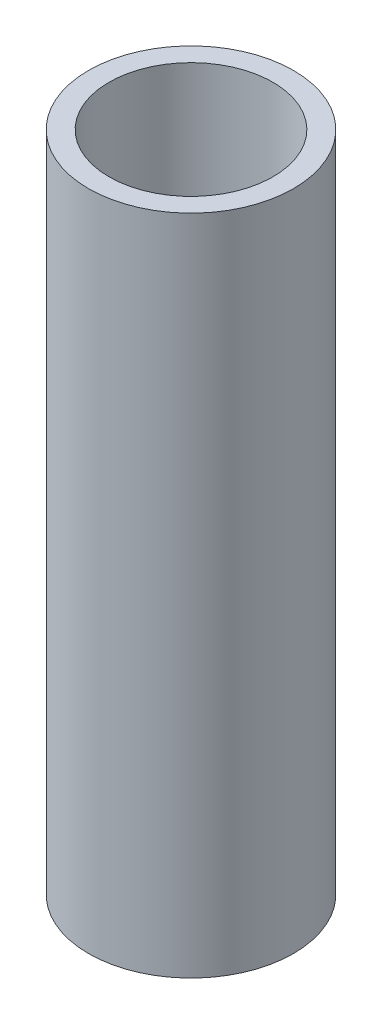
ISO-10303-21;
HEADER;
FILE_DESCRIPTION(('STEP AP214'),'2;1');
FILE_NAME('part.step','',(''),(''),'','','');
FILE_SCHEMA(('AUTOMOTIVE_DESIGN { 1 0 10303 214 1 1 1 1 }'));
ENDSEC;
DATA;
#1=APPLICATION_CONTEXT('core data for automotive mechanical design processes');
#2=APPLICATION_PROTOCOL_DEFINITION('international standard','automotive_design',2000,#1);
#3=PRODUCT_CONTEXT('',#1,'mechanical');
#4=PRODUCT('Part','Part','',(#3));
#5=PRODUCT_RELATED_PRODUCT_CATEGORY('part','',(#4));
#6=PRODUCT_DEFINITION_FORMATION('','',#4);
#7=PRODUCT_DEFINITION_CONTEXT('part definition',#1,'design');
#8=PRODUCT_DEFINITION('design','',#6,#7);
#9=PRODUCT_DEFINITION_SHAPE('','',#8);
#10=(LENGTH_UNIT() NAMED_UNIT(*) SI_UNIT(.MILLI.,.METRE.));
#11=(NAMED_UNIT(*) PLANE_ANGLE_UNIT() SI_UNIT($,.RADIAN.));
#12=(NAMED_UNIT(*) SI_UNIT($,.STERADIAN.) SOLID_ANGLE_UNIT());
#13=UNCERTAINTY_MEASURE_WITH_UNIT(LENGTH_MEASURE(1.E-05),#10,'distance_accuracy_value','');
#14=(GEOMETRIC_REPRESENTATION_CONTEXT(3) GLOBAL_UNCERTAINTY_ASSIGNED_CONTEXT((#13)) GLOBAL_UNIT_ASSIGNED_CONTEXT((#10,
#11,#12)) REPRESENTATION_CONTEXT('',''));
#15=CARTESIAN_POINT('',(0.,0.,0.));
#16=DIRECTION('',(0.,0.,1.));
#17=DIRECTION('',(1.,0.,0.));
#18=AXIS2_PLACEMENT_3D('',#15,#16,#17);
#19=CARTESIAN_POINT('',(0.,2.425,0.));
#20=DIRECTION('',(0.,-1.,0.));
#21=DIRECTION('',(0.,0.,-1.));
#22=AXIS2_PLACEMENT_3D('',#19,#20,#21);
#23=CYLINDRICAL_SURFACE('',#22,0.375);
#24=CARTESIAN_POINT('',(0.,2.425,0.));
#25=DIRECTION('',(0.,1.,0.));
#26=DIRECTION('',(0.,0.,1.));
#27=AXIS2_PLACEMENT_3D('',#24,#25,#26);
#28=CIRCLE('',#27,0.375);
#29=CARTESIAN_POINT('',(0.,2.425,0.375));
#30=VERTEX_POINT('',#29);
#31=EDGE_CURVE('E10',#30,#30,#28,.T.);
#32=ORIENTED_EDGE('',*,*,#31,.F.);
#33=EDGE_LOOP('',(#32));
#34=FACE_BOUND('',#33,.T.);
#35=CARTESIAN_POINT('',(0.,0.,0.));
#36=DIRECTION('',(0.,1.,0.));
#37=DIRECTION('',(0.,0.,1.));
#38=AXIS2_PLACEMENT_3D('',#35,#36,#37);
#39=CIRCLE('',#38,0.375);
#40=CARTESIAN_POINT('',(0.,0.,0.375));
#41=VERTEX_POINT('',#40);
#42=EDGE_CURVE('E34',#41,#41,#39,.T.);
#43=ORIENTED_EDGE('',*,*,#42,.T.);
#44=EDGE_LOOP('',(#43));
#45=FACE_BOUND('',#44,.T.);
#46=ADVANCED_FACE('F31',(#34,#45),#23,.T.);
#47=CARTESIAN_POINT('',(0.,2.425,0.));
#48=DIRECTION('',(0.,1.,0.));
#49=DIRECTION('',(0.,0.,1.));
#50=AXIS2_PLACEMENT_3D('',#47,#48,#49);
#51=PLANE('',#50);
#52=CARTESIAN_POINT('',(0.,2.425,0.));
#53=DIRECTION('',(0.,1.,0.));
#54=DIRECTION('',(0.,0.,1.));
#55=AXIS2_PLACEMENT_3D('',#52,#53,#54);
#56=CIRCLE('',#55,0.299999999999999);
#57=CARTESIAN_POINT('',(0.,2.425,0.299999999999999));
#58=VERTEX_POINT('',#57);
#59=EDGE_CURVE('E45',#58,#58,#56,.T.);
#60=ORIENTED_EDGE('',*,*,#59,.F.);
#61=EDGE_LOOP('',(#60));
#62=FACE_BOUND('',#61,.T.);
#63=ORIENTED_EDGE('',*,*,#31,.T.);
#64=EDGE_LOOP('',(#63));
#65=FACE_BOUND('',#64,.T.);
#66=ADVANCED_FACE('F52',(#62,#65),#51,.T.);
#67=CARTESIAN_POINT('',(0.,0.,0.));
#68=DIRECTION('',(0.,1.,0.));
#69=DIRECTION('',(0.,0.,1.));
#70=AXIS2_PLACEMENT_3D('',#67,#68,#69);
#71=PLANE('',#70);
#72=CARTESIAN_POINT('',(0.,0.,0.));
#73=DIRECTION('',(0.,1.,0.));
#74=DIRECTION('',(0.,0.,1.));
#75=AXIS2_PLACEMENT_3D('',#72,#73,#74);
#76=CIRCLE('',#75,0.299999999999998);
#77=CARTESIAN_POINT('',(0.,0.,0.299999999999998));
#78=VERTEX_POINT('',#77);
#79=EDGE_CURVE('E41',#78,#78,#76,.T.);
#80=ORIENTED_EDGE('',*,*,#79,.T.);
#81=EDGE_LOOP('',(#80));
#82=FACE_BOUND('',#81,.T.);
#83=ORIENTED_EDGE('',*,*,#42,.F.);
#84=EDGE_LOOP('',(#83));
#85=FACE_BOUND('',#84,.T.);
#86=ADVANCED_FACE('F54',(#82,#85),#71,.F.);
#87=CARTESIAN_POINT('',(0.,2.425,0.));
#88=DIRECTION('',(0.,1.,0.));
#89=DIRECTION('',(0.,0.,1.));
#90=AXIS2_PLACEMENT_3D('',#87,#88,#89);
#91=CYLINDRICAL_SURFACE('',#90,0.299999999999998);
#92=ORIENTED_EDGE('',*,*,#59,.T.);
#93=EDGE_LOOP('',(#92));
#94=FACE_BOUND('',#93,.T.);
#95=ORIENTED_EDGE('',*,*,#79,.F.);
#96=EDGE_LOOP('',(#95));
#97=FACE_BOUND('',#96,.T.);
#98=ADVANCED_FACE('F49',(#94,#97),#91,.F.);
#99=CLOSED_SHELL('',(#46,#66,#86,#98));
#100=MANIFOLD_SOLID_BREP('B2',#99);
#101=ADVANCED_BREP_SHAPE_REPRESENTATION('',(#18,#100),#14);
#102=SHAPE_DEFINITION_REPRESENTATION(#9,#101);
ENDSEC;
END-ISO-10303-21;
